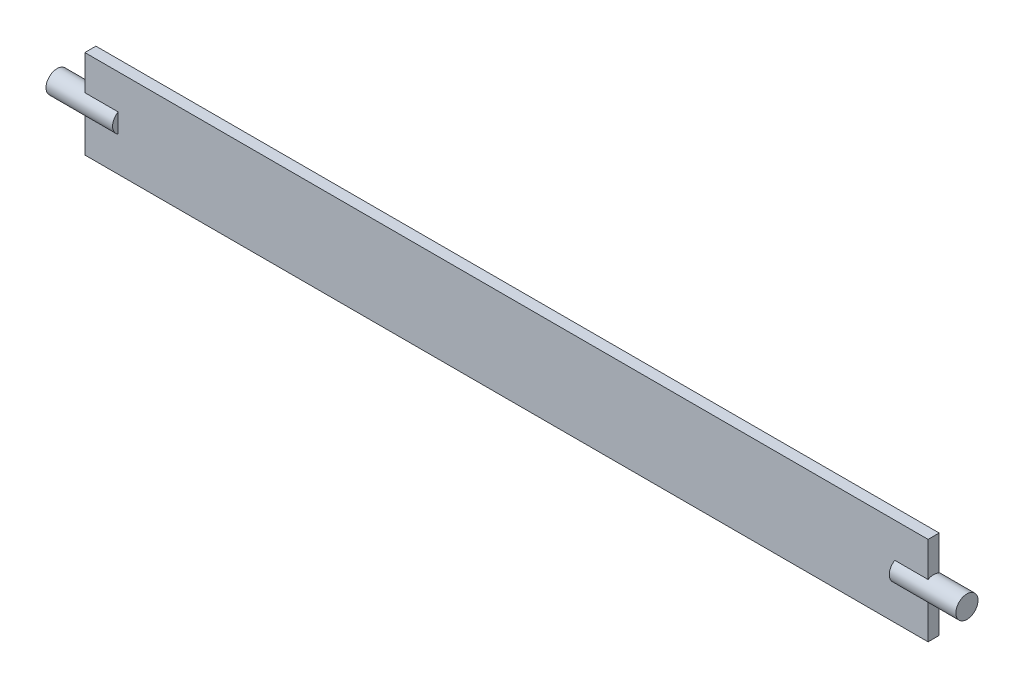
ISO-10303-21;
HEADER;
FILE_DESCRIPTION(('STEP AP214'),'2;1');
FILE_NAME('part.step','',(''),(''),'','','');
FILE_SCHEMA(('AUTOMOTIVE_DESIGN { 1 0 10303 214 1 1 1 1 }'));
ENDSEC;
DATA;
#1=APPLICATION_CONTEXT('core data for automotive mechanical design processes');
#2=APPLICATION_PROTOCOL_DEFINITION('international standard','automotive_design',2000,#1);
#3=PRODUCT_CONTEXT('',#1,'mechanical');
#4=PRODUCT('Part','Part','',(#3));
#5=PRODUCT_RELATED_PRODUCT_CATEGORY('part','',(#4));
#6=PRODUCT_DEFINITION_FORMATION('','',#4);
#7=PRODUCT_DEFINITION_CONTEXT('part definition',#1,'design');
#8=PRODUCT_DEFINITION('design','',#6,#7);
#9=PRODUCT_DEFINITION_SHAPE('','',#8);
#10=(LENGTH_UNIT() NAMED_UNIT(*) SI_UNIT(.MILLI.,.METRE.));
#11=(NAMED_UNIT(*) PLANE_ANGLE_UNIT() SI_UNIT($,.RADIAN.));
#12=(NAMED_UNIT(*) SI_UNIT($,.STERADIAN.) SOLID_ANGLE_UNIT());
#13=UNCERTAINTY_MEASURE_WITH_UNIT(LENGTH_MEASURE(1.E-05),#10,'distance_accuracy_value','');
#14=(GEOMETRIC_REPRESENTATION_CONTEXT(3) GLOBAL_UNCERTAINTY_ASSIGNED_CONTEXT((#13)) GLOBAL_UNIT_ASSIGNED_CONTEXT((#10,
#11,#12)) REPRESENTATION_CONTEXT('',''));
#15=CARTESIAN_POINT('',(0.,0.,0.));
#16=DIRECTION('',(0.,0.,1.));
#17=DIRECTION('',(1.,0.,0.));
#18=AXIS2_PLACEMENT_3D('',#15,#16,#17);
#19=CARTESIAN_POINT('',(190.,20.,-5.));
#20=DIRECTION('',(1.,0.,0.));
#21=DIRECTION('',(0.,0.,-1.));
#22=AXIS2_PLACEMENT_3D('',#19,#20,#21);
#23=PLANE('',#22);
#24=CARTESIAN_POINT('',(190.,0.,-2.5));
#25=DIRECTION('',(1.,0.,0.));
#26=DIRECTION('',(0.,0.,-1.));
#27=AXIS2_PLACEMENT_3D('',#24,#25,#26);
#28=CIRCLE('',#27,5.);
#29=CARTESIAN_POINT('',(190.,4.33012701892219,-5.));
#30=VERTEX_POINT('',#29);
#31=CARTESIAN_POINT('',(190.,4.33012701892219,0.));
#32=VERTEX_POINT('',#31);
#33=EDGE_CURVE('E41',#30,#32,#28,.T.);
#34=ORIENTED_EDGE('',*,*,#33,.F.);
#35=DIRECTION('',(0.,1.,0.));
#36=VECTOR('',#35,1.);
#37=CARTESIAN_POINT('',(190.,20.,-5.));
#38=LINE('',#37,#36);
#39=CARTESIAN_POINT('',(190.,20.,-5.));
#40=VERTEX_POINT('',#39);
#41=EDGE_CURVE('E129',#30,#40,#38,.T.);
#42=ORIENTED_EDGE('',*,*,#41,.T.);
#43=DIRECTION('',(0.,0.,1.));
#44=VECTOR('',#43,1.);
#45=CARTESIAN_POINT('',(190.,20.,-5.));
#46=LINE('',#45,#44);
#47=CARTESIAN_POINT('',(190.,20.,0.));
#48=VERTEX_POINT('',#47);
#49=EDGE_CURVE('E153',#40,#48,#46,.T.);
#50=ORIENTED_EDGE('',*,*,#49,.T.);
#51=DIRECTION('',(0.,1.,0.));
#52=VECTOR('',#51,1.);
#53=CARTESIAN_POINT('',(190.,20.,0.));
#54=LINE('',#53,#52);
#55=EDGE_CURVE('E175',#32,#48,#54,.T.);
#56=ORIENTED_EDGE('',*,*,#55,.F.);
#57=EDGE_LOOP('',(#34,#42,#50,#56));
#58=FACE_BOUND('',#57,.T.);
#59=ADVANCED_FACE('F33',(#58),#23,.T.);
#60=CARTESIAN_POINT('',(-190.,20.,-5.));
#61=DIRECTION('',(-1.,0.,0.));
#62=DIRECTION('',(0.,0.,1.));
#63=AXIS2_PLACEMENT_3D('',#60,#61,#62);
#64=PLANE('',#63);
#65=DIRECTION('',(0.,-1.,0.));
#66=VECTOR('',#65,1.);
#67=CARTESIAN_POINT('',(-190.,20.,0.));
#68=LINE('',#67,#66);
#69=CARTESIAN_POINT('',(-190.,-4.33012701892219,0.));
#70=VERTEX_POINT('',#69);
#71=CARTESIAN_POINT('',(-190.,-20.,0.));
#72=VERTEX_POINT('',#71);
#73=EDGE_CURVE('E169',#70,#72,#68,.T.);
#74=ORIENTED_EDGE('',*,*,#73,.F.);
#75=CARTESIAN_POINT('',(-190.,0.,-2.5));
#76=DIRECTION('',(-1.,0.,0.));
#77=DIRECTION('',(0.,0.,1.));
#78=AXIS2_PLACEMENT_3D('',#75,#76,#77);
#79=CIRCLE('',#78,5.);
#80=CARTESIAN_POINT('',(-190.,-4.33012701892219,-5.));
#81=VERTEX_POINT('',#80);
#82=EDGE_CURVE('E185',#70,#81,#79,.F.);
#83=ORIENTED_EDGE('',*,*,#82,.T.);
#84=DIRECTION('',(0.,-1.,0.));
#85=VECTOR('',#84,1.);
#86=CARTESIAN_POINT('',(-190.,20.,-5.));
#87=LINE('',#86,#85);
#88=CARTESIAN_POINT('',(-190.,-20.,-5.));
#89=VERTEX_POINT('',#88);
#90=EDGE_CURVE('E180',#81,#89,#87,.T.);
#91=ORIENTED_EDGE('',*,*,#90,.T.);
#92=DIRECTION('',(0.,0.,1.));
#93=VECTOR('',#92,1.);
#94=CARTESIAN_POINT('',(-190.,-20.,-5.));
#95=LINE('',#94,#93);
#96=EDGE_CURVE('E159',#89,#72,#95,.T.);
#97=ORIENTED_EDGE('',*,*,#96,.T.);
#98=EDGE_LOOP('',(#74,#83,#91,#97));
#99=FACE_BOUND('',#98,.T.);
#100=ADVANCED_FACE('F242',(#99),#64,.T.);
#101=CARTESIAN_POINT('',(0.,0.,-5.));
#102=DIRECTION('',(0.,0.,1.));
#103=DIRECTION('',(1.,0.,0.));
#104=AXIS2_PLACEMENT_3D('',#101,#102,#103);
#105=PLANE('',#104);
#106=ORIENTED_EDGE('',*,*,#41,.F.);
#107=DIRECTION('',(-1.,0.,0.));
#108=VECTOR('',#107,1.);
#109=CARTESIAN_POINT('',(205.,4.33012701892219,-5.));
#110=LINE('',#109,#108);
#111=CARTESIAN_POINT('',(175.,4.33012701892219,-5.));
#112=VERTEX_POINT('',#111);
#113=EDGE_CURVE('E48',#30,#112,#110,.T.);
#114=ORIENTED_EDGE('',*,*,#113,.T.);
#115=DIRECTION('',(0.,1.,0.));
#116=VECTOR('',#115,1.);
#117=CARTESIAN_POINT('',(175.,0.,-5.));
#118=LINE('',#117,#116);
#119=CARTESIAN_POINT('',(175.,-4.33012701892219,-5.));
#120=VERTEX_POINT('',#119);
#121=EDGE_CURVE('E52',#120,#112,#118,.T.);
#122=ORIENTED_EDGE('',*,*,#121,.F.);
#123=DIRECTION('',(-1.,0.,0.));
#124=VECTOR('',#123,1.);
#125=CARTESIAN_POINT('',(205.,-4.33012701892219,-5.));
#126=LINE('',#125,#124);
#127=CARTESIAN_POINT('',(190.,-4.33012701892219,-5.));
#128=VERTEX_POINT('',#127);
#129=EDGE_CURVE('E131',#120,#128,#126,.F.);
#130=ORIENTED_EDGE('',*,*,#129,.T.);
#131=CARTESIAN_POINT('',(190.,-20.,-5.));
#132=VERTEX_POINT('',#131);
#133=EDGE_CURVE('E120',#132,#128,#38,.T.);
#134=ORIENTED_EDGE('',*,*,#133,.F.);
#135=DIRECTION('',(1.,0.,0.));
#136=VECTOR('',#135,1.);
#137=CARTESIAN_POINT('',(-190.,-20.,-5.));
#138=LINE('',#137,#136);
#139=EDGE_CURVE('E157',#89,#132,#138,.T.);
#140=ORIENTED_EDGE('',*,*,#139,.F.);
#141=ORIENTED_EDGE('',*,*,#90,.F.);
#142=DIRECTION('',(1.,0.,0.));
#143=VECTOR('',#142,1.);
#144=CARTESIAN_POINT('',(-205.,-4.33012701892219,-5.));
#145=LINE('',#144,#143);
#146=CARTESIAN_POINT('',(-175.,-4.33012701892219,-5.));
#147=VERTEX_POINT('',#146);
#148=EDGE_CURVE('E183',#147,#81,#145,.F.);
#149=ORIENTED_EDGE('',*,*,#148,.F.);
#150=DIRECTION('',(0.,-1.,0.));
#151=VECTOR('',#150,1.);
#152=CARTESIAN_POINT('',(-175.,0.,-5.));
#153=LINE('',#152,#151);
#154=CARTESIAN_POINT('',(-175.,4.33012701892219,-5.));
#155=VERTEX_POINT('',#154);
#156=EDGE_CURVE('E191',#155,#147,#153,.T.);
#157=ORIENTED_EDGE('',*,*,#156,.F.);
#158=DIRECTION('',(1.,0.,0.));
#159=VECTOR('',#158,1.);
#160=CARTESIAN_POINT('',(-205.,4.33012701892219,-5.));
#161=LINE('',#160,#159);
#162=CARTESIAN_POINT('',(-190.,4.33012701892219,-5.));
#163=VERTEX_POINT('',#162);
#164=EDGE_CURVE('E186',#163,#155,#161,.T.);
#165=ORIENTED_EDGE('',*,*,#164,.F.);
#166=CARTESIAN_POINT('',(-190.,20.,-5.));
#167=VERTEX_POINT('',#166);
#168=EDGE_CURVE('E177',#167,#163,#87,.T.);
#169=ORIENTED_EDGE('',*,*,#168,.F.);
#170=DIRECTION('',(-1.,0.,0.));
#171=VECTOR('',#170,1.);
#172=CARTESIAN_POINT('',(-190.,20.,-5.));
#173=LINE('',#172,#171);
#174=EDGE_CURVE('E128',#40,#167,#173,.T.);
#175=ORIENTED_EDGE('',*,*,#174,.F.);
#176=EDGE_LOOP('',(#106,#114,#122,#130,#134,#140,#141,#149,#157,#165,#169,#175));
#177=FACE_BOUND('',#176,.T.);
#178=ADVANCED_FACE('F132',(#177),#105,.F.);
#179=CARTESIAN_POINT('',(0.,0.,0.));
#180=DIRECTION('',(0.,0.,1.));
#181=DIRECTION('',(1.,0.,0.));
#182=AXIS2_PLACEMENT_3D('',#179,#180,#181);
#183=PLANE('',#182);
#184=DIRECTION('',(-1.,0.,0.));
#185=VECTOR('',#184,1.);
#186=CARTESIAN_POINT('',(205.,4.33012701892219,0.));
#187=LINE('',#186,#185);
#188=CARTESIAN_POINT('',(175.,4.33012701892219,0.));
#189=VERTEX_POINT('',#188);
#190=EDGE_CURVE('E136',#32,#189,#187,.T.);
#191=ORIENTED_EDGE('',*,*,#190,.F.);
#192=ORIENTED_EDGE('',*,*,#55,.T.);
#193=DIRECTION('',(-1.,0.,0.));
#194=VECTOR('',#193,1.);
#195=CARTESIAN_POINT('',(-190.,20.,0.));
#196=LINE('',#195,#194);
#197=CARTESIAN_POINT('',(-190.,20.,0.));
#198=VERTEX_POINT('',#197);
#199=EDGE_CURVE('E170',#48,#198,#196,.T.);
#200=ORIENTED_EDGE('',*,*,#199,.T.);
#201=CARTESIAN_POINT('',(-190.,4.33012701892219,0.));
#202=VERTEX_POINT('',#201);
#203=EDGE_CURVE('E166',#198,#202,#68,.T.);
#204=ORIENTED_EDGE('',*,*,#203,.T.);
#205=DIRECTION('',(1.,0.,0.));
#206=VECTOR('',#205,1.);
#207=CARTESIAN_POINT('',(-205.,4.33012701892219,0.));
#208=LINE('',#207,#206);
#209=CARTESIAN_POINT('',(-175.,4.33012701892219,0.));
#210=VERTEX_POINT('',#209);
#211=EDGE_CURVE('E145',#202,#210,#208,.T.);
#212=ORIENTED_EDGE('',*,*,#211,.T.);
#213=DIRECTION('',(0.,-1.,0.));
#214=VECTOR('',#213,1.);
#215=CARTESIAN_POINT('',(-175.,0.,0.));
#216=LINE('',#215,#214);
#217=CARTESIAN_POINT('',(-175.,-4.33012701892219,0.));
#218=VERTEX_POINT('',#217);
#219=EDGE_CURVE('E150',#210,#218,#216,.T.);
#220=ORIENTED_EDGE('',*,*,#219,.T.);
#221=DIRECTION('',(1.,0.,0.));
#222=VECTOR('',#221,1.);
#223=CARTESIAN_POINT('',(-205.,-4.33012701892219,0.));
#224=LINE('',#223,#222);
#225=EDGE_CURVE('E142',#218,#70,#224,.F.);
#226=ORIENTED_EDGE('',*,*,#225,.T.);
#227=ORIENTED_EDGE('',*,*,#73,.T.);
#228=DIRECTION('',(1.,0.,0.));
#229=VECTOR('',#228,1.);
#230=CARTESIAN_POINT('',(-190.,-20.,0.));
#231=LINE('',#230,#229);
#232=CARTESIAN_POINT('',(190.,-20.,0.));
#233=VERTEX_POINT('',#232);
#234=EDGE_CURVE('E163',#72,#233,#231,.T.);
#235=ORIENTED_EDGE('',*,*,#234,.T.);
#236=CARTESIAN_POINT('',(190.,-4.33012701892219,0.));
#237=VERTEX_POINT('',#236);
#238=EDGE_CURVE('E173',#233,#237,#54,.T.);
#239=ORIENTED_EDGE('',*,*,#238,.T.);
#240=DIRECTION('',(-1.,0.,0.));
#241=VECTOR('',#240,1.);
#242=CARTESIAN_POINT('',(205.,-4.33012701892219,0.));
#243=LINE('',#242,#241);
#244=CARTESIAN_POINT('',(175.,-4.33012701892219,0.));
#245=VERTEX_POINT('',#244);
#246=EDGE_CURVE('E137',#245,#237,#243,.F.);
#247=ORIENTED_EDGE('',*,*,#246,.F.);
#248=DIRECTION('',(0.,1.,0.));
#249=VECTOR('',#248,1.);
#250=CARTESIAN_POINT('',(175.,0.,0.));
#251=LINE('',#250,#249);
#252=EDGE_CURVE('E11',#245,#189,#251,.T.);
#253=ORIENTED_EDGE('',*,*,#252,.T.);
#254=EDGE_LOOP('',(#191,#192,#200,#204,#212,#220,#226,#227,#235,#239,#247,#253));
#255=FACE_BOUND('',#254,.T.);
#256=ADVANCED_FACE('F226',(#255),#183,.T.);
#257=EDGE_CURVE('E123',#237,#128,#28,.T.);
#258=ORIENTED_EDGE('',*,*,#257,.F.);
#259=ORIENTED_EDGE('',*,*,#238,.F.);
#260=DIRECTION('',(0.,0.,1.));
#261=VECTOR('',#260,1.);
#262=CARTESIAN_POINT('',(190.,-20.,-5.));
#263=LINE('',#262,#261);
#264=EDGE_CURVE('E125',#132,#233,#263,.T.);
#265=ORIENTED_EDGE('',*,*,#264,.F.);
#266=ORIENTED_EDGE('',*,*,#133,.T.);
#267=EDGE_LOOP('',(#258,#259,#265,#266));
#268=FACE_BOUND('',#267,.T.);
#269=ADVANCED_FACE('F35',(#268),#23,.T.);
#270=CARTESIAN_POINT('',(-190.,-20.,-5.));
#271=DIRECTION('',(0.,-1.,0.));
#272=DIRECTION('',(0.,0.,-1.));
#273=AXIS2_PLACEMENT_3D('',#270,#271,#272);
#274=PLANE('',#273);
#275=ORIENTED_EDGE('',*,*,#234,.F.);
#276=ORIENTED_EDGE('',*,*,#96,.F.);
#277=ORIENTED_EDGE('',*,*,#139,.T.);
#278=ORIENTED_EDGE('',*,*,#264,.T.);
#279=EDGE_LOOP('',(#275,#276,#277,#278));
#280=FACE_BOUND('',#279,.T.);
#281=ADVANCED_FACE('F250',(#280),#274,.T.);
#282=ORIENTED_EDGE('',*,*,#168,.T.);
#283=EDGE_CURVE('E188',#163,#202,#79,.F.);
#284=ORIENTED_EDGE('',*,*,#283,.T.);
#285=ORIENTED_EDGE('',*,*,#203,.F.);
#286=DIRECTION('',(0.,0.,1.));
#287=VECTOR('',#286,1.);
#288=CARTESIAN_POINT('',(-190.,20.,-5.));
#289=LINE('',#288,#287);
#290=EDGE_CURVE('E156',#167,#198,#289,.T.);
#291=ORIENTED_EDGE('',*,*,#290,.F.);
#292=EDGE_LOOP('',(#282,#284,#285,#291));
#293=FACE_BOUND('',#292,.T.);
#294=ADVANCED_FACE('F248',(#293),#64,.T.);
#295=CARTESIAN_POINT('',(-190.,20.,-5.));
#296=DIRECTION('',(0.,1.,0.));
#297=DIRECTION('',(0.,0.,1.));
#298=AXIS2_PLACEMENT_3D('',#295,#296,#297);
#299=PLANE('',#298);
#300=ORIENTED_EDGE('',*,*,#199,.F.);
#301=ORIENTED_EDGE('',*,*,#49,.F.);
#302=ORIENTED_EDGE('',*,*,#174,.T.);
#303=ORIENTED_EDGE('',*,*,#290,.T.);
#304=EDGE_LOOP('',(#300,#301,#302,#303));
#305=FACE_BOUND('',#304,.T.);
#306=ADVANCED_FACE('F223',(#305),#299,.T.);
#307=CARTESIAN_POINT('',(-205.,0.,-2.5));
#308=DIRECTION('',(1.,0.,0.));
#309=DIRECTION('',(0.,0.,-1.));
#310=AXIS2_PLACEMENT_3D('',#307,#308,#309);
#311=CYLINDRICAL_SURFACE('',#310,5.);
#312=CARTESIAN_POINT('',(-205.,0.,-2.5));
#313=DIRECTION('',(-1.,0.,0.));
#314=DIRECTION('',(0.,0.,1.));
#315=AXIS2_PLACEMENT_3D('',#312,#313,#314);
#316=CIRCLE('',#315,5.);
#317=CARTESIAN_POINT('',(-205.,0.,2.5));
#318=VERTEX_POINT('',#317);
#319=EDGE_CURVE('E193',#318,#318,#316,.T.);
#320=ORIENTED_EDGE('',*,*,#319,.F.);
#321=EDGE_LOOP('',(#320));
#322=FACE_BOUND('',#321,.T.);
#323=CARTESIAN_POINT('',(-175.,0.,-2.5));
#324=DIRECTION('',(-1.,0.,0.));
#325=DIRECTION('',(0.,0.,1.));
#326=AXIS2_PLACEMENT_3D('',#323,#324,#325);
#327=CIRCLE('',#326,5.);
#328=EDGE_CURVE('E197',#155,#147,#327,.T.);
#329=ORIENTED_EDGE('',*,*,#328,.T.);
#330=ORIENTED_EDGE('',*,*,#148,.T.);
#331=ORIENTED_EDGE('',*,*,#82,.F.);
#332=ORIENTED_EDGE('',*,*,#225,.F.);
#333=EDGE_CURVE('E194',#218,#210,#327,.T.);
#334=ORIENTED_EDGE('',*,*,#333,.T.);
#335=ORIENTED_EDGE('',*,*,#211,.F.);
#336=ORIENTED_EDGE('',*,*,#283,.F.);
#337=ORIENTED_EDGE('',*,*,#164,.T.);
#338=EDGE_LOOP('',(#329,#330,#331,#332,#334,#335,#336,#337));
#339=FACE_BOUND('',#338,.T.);
#340=ADVANCED_FACE('F266',(#322,#339),#311,.T.);
#341=CARTESIAN_POINT('',(-175.,0.,-2.5));
#342=DIRECTION('',(-1.,0.,0.));
#343=DIRECTION('',(0.,0.,1.));
#344=AXIS2_PLACEMENT_3D('',#341,#342,#343);
#345=PLANE('',#344);
#346=ORIENTED_EDGE('',*,*,#328,.F.);
#347=ORIENTED_EDGE('',*,*,#156,.T.);
#348=EDGE_LOOP('',(#346,#347));
#349=FACE_BOUND('',#348,.T.);
#350=ADVANCED_FACE('F270',(#349),#345,.F.);
#351=CARTESIAN_POINT('',(-205.,0.,-2.5));
#352=DIRECTION('',(-1.,0.,0.));
#353=DIRECTION('',(0.,0.,1.));
#354=AXIS2_PLACEMENT_3D('',#351,#352,#353);
#355=PLANE('',#354);
#356=ORIENTED_EDGE('',*,*,#319,.T.);
#357=EDGE_LOOP('',(#356));
#358=FACE_BOUND('',#357,.T.);
#359=ADVANCED_FACE('F275',(#358),#355,.T.);
#360=ORIENTED_EDGE('',*,*,#219,.F.);
#361=ORIENTED_EDGE('',*,*,#333,.F.);
#362=EDGE_LOOP('',(#360,#361));
#363=FACE_BOUND('',#362,.T.);
#364=ADVANCED_FACE('F240',(#363),#345,.F.);
#365=CARTESIAN_POINT('',(175.,0.,-2.5));
#366=DIRECTION('',(1.,0.,0.));
#367=DIRECTION('',(0.,0.,1.));
#368=AXIS2_PLACEMENT_3D('',#365,#366,#367);
#369=PLANE('',#368);
#370=CARTESIAN_POINT('',(175.,0.,-2.5));
#371=DIRECTION('',(-1.,0.,0.));
#372=DIRECTION('',(0.,0.,1.));
#373=AXIS2_PLACEMENT_3D('',#370,#371,#372);
#374=CIRCLE('',#373,5.);
#375=EDGE_CURVE('E209',#112,#120,#374,.T.);
#376=ORIENTED_EDGE('',*,*,#375,.T.);
#377=ORIENTED_EDGE('',*,*,#121,.T.);
#378=EDGE_LOOP('',(#376,#377));
#379=FACE_BOUND('',#378,.T.);
#380=ADVANCED_FACE('F214',(#379),#369,.F.);
#381=CARTESIAN_POINT('',(205.,0.,-2.5));
#382=DIRECTION('',(-1.,0.,0.));
#383=DIRECTION('',(0.,0.,1.));
#384=AXIS2_PLACEMENT_3D('',#381,#382,#383);
#385=CYLINDRICAL_SURFACE('',#384,5.);
#386=CARTESIAN_POINT('',(205.,0.,-2.5));
#387=DIRECTION('',(-1.,0.,0.));
#388=DIRECTION('',(0.,0.,1.));
#389=AXIS2_PLACEMENT_3D('',#386,#387,#388);
#390=CIRCLE('',#389,5.);
#391=CARTESIAN_POINT('',(205.,0.,2.5));
#392=VERTEX_POINT('',#391);
#393=EDGE_CURVE('E205',#392,#392,#390,.T.);
#394=ORIENTED_EDGE('',*,*,#393,.T.);
#395=EDGE_LOOP('',(#394));
#396=FACE_BOUND('',#395,.T.);
#397=ORIENTED_EDGE('',*,*,#113,.F.);
#398=ORIENTED_EDGE('',*,*,#33,.T.);
#399=ORIENTED_EDGE('',*,*,#190,.T.);
#400=EDGE_CURVE('E206',#245,#189,#374,.T.);
#401=ORIENTED_EDGE('',*,*,#400,.F.);
#402=ORIENTED_EDGE('',*,*,#246,.T.);
#403=ORIENTED_EDGE('',*,*,#257,.T.);
#404=ORIENTED_EDGE('',*,*,#129,.F.);
#405=ORIENTED_EDGE('',*,*,#375,.F.);
#406=EDGE_LOOP('',(#397,#398,#399,#401,#402,#403,#404,#405));
#407=FACE_BOUND('',#406,.T.);
#408=ADVANCED_FACE('F140',(#396,#407),#385,.T.);
#409=CARTESIAN_POINT('',(205.,0.,-2.5));
#410=DIRECTION('',(1.,0.,0.));
#411=DIRECTION('',(0.,0.,1.));
#412=AXIS2_PLACEMENT_3D('',#409,#410,#411);
#413=PLANE('',#412);
#414=ORIENTED_EDGE('',*,*,#393,.F.);
#415=EDGE_LOOP('',(#414));
#416=FACE_BOUND('',#415,.T.);
#417=ADVANCED_FACE('F231',(#416),#413,.T.);
#418=ORIENTED_EDGE('',*,*,#252,.F.);
#419=ORIENTED_EDGE('',*,*,#400,.T.);
#420=EDGE_LOOP('',(#418,#419));
#421=FACE_BOUND('',#420,.T.);
#422=ADVANCED_FACE('F229',(#421),#369,.F.);
#423=CLOSED_SHELL('',(#59,#100,#178,#256,#269,#281,#294,#306,#340,#350,#359,#364,#380,#408,#417,#422));
#424=MANIFOLD_SOLID_BREP('B2',#423);
#425=ADVANCED_BREP_SHAPE_REPRESENTATION('',(#18,#424),#14);
#426=SHAPE_DEFINITION_REPRESENTATION(#9,#425);
ENDSEC;
END-ISO-10303-21;
